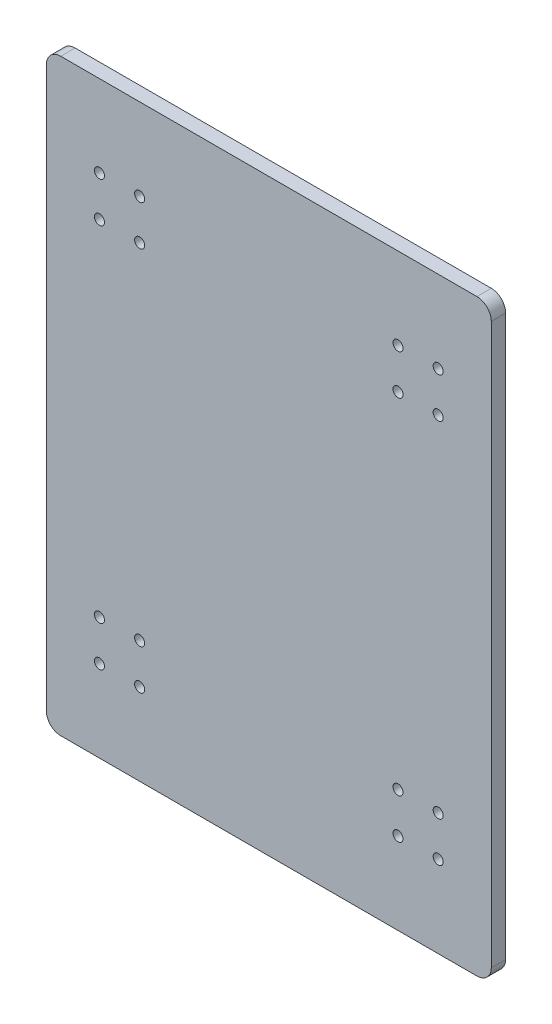
ISO-10303-21;
HEADER;
FILE_DESCRIPTION(('STEP AP214'),'2;1');
FILE_NAME('part.step','',(''),(''),'','','');
FILE_SCHEMA(('AUTOMOTIVE_DESIGN { 1 0 10303 214 1 1 1 1 }'));
ENDSEC;
DATA;
#1=APPLICATION_CONTEXT('core data for automotive mechanical design processes');
#2=APPLICATION_PROTOCOL_DEFINITION('international standard','automotive_design',2000,#1);
#3=PRODUCT_CONTEXT('',#1,'mechanical');
#4=PRODUCT('Part','Part','',(#3));
#5=PRODUCT_RELATED_PRODUCT_CATEGORY('part','',(#4));
#6=PRODUCT_DEFINITION_FORMATION('','',#4);
#7=PRODUCT_DEFINITION_CONTEXT('part definition',#1,'design');
#8=PRODUCT_DEFINITION('design','',#6,#7);
#9=PRODUCT_DEFINITION_SHAPE('','',#8);
#10=(LENGTH_UNIT() NAMED_UNIT(*) SI_UNIT(.MILLI.,.METRE.));
#11=(NAMED_UNIT(*) PLANE_ANGLE_UNIT() SI_UNIT($,.RADIAN.));
#12=(NAMED_UNIT(*) SI_UNIT($,.STERADIAN.) SOLID_ANGLE_UNIT());
#13=UNCERTAINTY_MEASURE_WITH_UNIT(LENGTH_MEASURE(1.E-05),#10,'distance_accuracy_value','');
#14=(GEOMETRIC_REPRESENTATION_CONTEXT(3) GLOBAL_UNCERTAINTY_ASSIGNED_CONTEXT((#13)) GLOBAL_UNIT_ASSIGNED_CONTEXT((#10,
#11,#12)) REPRESENTATION_CONTEXT('',''));
#15=CARTESIAN_POINT('',(0.,0.,0.));
#16=DIRECTION('',(0.,0.,1.));
#17=DIRECTION('',(1.,0.,0.));
#18=AXIS2_PLACEMENT_3D('',#15,#16,#17);
#19=CARTESIAN_POINT('',(77.5,102.5,5.));
#20=DIRECTION('',(-1.,0.,0.));
#21=DIRECTION('',(0.,0.,1.));
#22=AXIS2_PLACEMENT_3D('',#19,#20,#21);
#23=PLANE('',#22);
#24=DIRECTION('',(0.,1.,0.));
#25=VECTOR('',#24,1.);
#26=CARTESIAN_POINT('',(77.5,102.5,5.));
#27=LINE('',#26,#25);
#28=CARTESIAN_POINT('',(77.5,-97.4999999999999,5.));
#29=VERTEX_POINT('',#28);
#30=CARTESIAN_POINT('',(77.5,97.5,5.));
#31=VERTEX_POINT('',#30);
#32=EDGE_CURVE('E141',#29,#31,#27,.T.);
#33=ORIENTED_EDGE('',*,*,#32,.F.);
#34=DIRECTION('',(0.,0.,-1.));
#35=VECTOR('',#34,1.);
#36=CARTESIAN_POINT('',(77.5,-97.4999999999999,5.));
#37=LINE('',#36,#35);
#38=CARTESIAN_POINT('',(77.5,-97.4999999999999,0.));
#39=VERTEX_POINT('',#38);
#40=EDGE_CURVE('E180',#29,#39,#37,.T.);
#41=ORIENTED_EDGE('',*,*,#40,.T.);
#42=DIRECTION('',(0.,1.,0.));
#43=VECTOR('',#42,1.);
#44=CARTESIAN_POINT('',(77.5,102.5,0.));
#45=LINE('',#44,#43);
#46=CARTESIAN_POINT('',(77.5,97.5,0.));
#47=VERTEX_POINT('',#46);
#48=EDGE_CURVE('E195',#39,#47,#45,.T.);
#49=ORIENTED_EDGE('',*,*,#48,.T.);
#50=DIRECTION('',(0.,0.,-1.));
#51=VECTOR('',#50,1.);
#52=CARTESIAN_POINT('',(77.5,97.5,5.));
#53=LINE('',#52,#51);
#54=EDGE_CURVE('E177',#47,#31,#53,.F.);
#55=ORIENTED_EDGE('',*,*,#54,.T.);
#56=EDGE_LOOP('',(#33,#41,#49,#55));
#57=FACE_BOUND('',#56,.T.);
#58=ADVANCED_FACE('F45',(#57),#23,.F.);
#59=CARTESIAN_POINT('',(-77.5,102.5,5.));
#60=DIRECTION('',(0.,-1.,0.));
#61=DIRECTION('',(0.,0.,-1.));
#62=AXIS2_PLACEMENT_3D('',#59,#60,#61);
#63=PLANE('',#62);
#64=DIRECTION('',(-1.,0.,0.));
#65=VECTOR('',#64,1.);
#66=CARTESIAN_POINT('',(-77.5,102.5,5.));
#67=LINE('',#66,#65);
#68=CARTESIAN_POINT('',(72.5,102.5,5.));
#69=VERTEX_POINT('',#68);
#70=CARTESIAN_POINT('',(-72.5,102.5,5.));
#71=VERTEX_POINT('',#70);
#72=EDGE_CURVE('E146',#69,#71,#67,.T.);
#73=ORIENTED_EDGE('',*,*,#72,.F.);
#74=DIRECTION('',(0.,0.,-1.));
#75=VECTOR('',#74,1.);
#76=CARTESIAN_POINT('',(72.5,102.5,5.));
#77=LINE('',#76,#75);
#78=CARTESIAN_POINT('',(72.5,102.5,0.));
#79=VERTEX_POINT('',#78);
#80=EDGE_CURVE('E11',#69,#79,#77,.T.);
#81=ORIENTED_EDGE('',*,*,#80,.T.);
#82=DIRECTION('',(-1.,0.,0.));
#83=VECTOR('',#82,1.);
#84=CARTESIAN_POINT('',(-77.5,102.5,0.));
#85=LINE('',#84,#83);
#86=CARTESIAN_POINT('',(-72.5,102.5,0.));
#87=VERTEX_POINT('',#86);
#88=EDGE_CURVE('E148',#79,#87,#85,.T.);
#89=ORIENTED_EDGE('',*,*,#88,.T.);
#90=DIRECTION('',(0.,0.,-1.));
#91=VECTOR('',#90,1.);
#92=CARTESIAN_POINT('',(-72.5,102.5,5.));
#93=LINE('',#92,#91);
#94=EDGE_CURVE('E54',#87,#71,#93,.F.);
#95=ORIENTED_EDGE('',*,*,#94,.T.);
#96=EDGE_LOOP('',(#73,#81,#89,#95));
#97=FACE_BOUND('',#96,.T.);
#98=ADVANCED_FACE('F201',(#97),#63,.F.);
#99=CARTESIAN_POINT('',(-77.5,102.5,5.));
#100=DIRECTION('',(1.,0.,0.));
#101=DIRECTION('',(0.,1.,0.));
#102=AXIS2_PLACEMENT_3D('',#99,#100,#101);
#103=PLANE('',#102);
#104=DIRECTION('',(0.,-1.,0.));
#105=VECTOR('',#104,1.);
#106=CARTESIAN_POINT('',(-77.5,102.5,0.));
#107=LINE('',#106,#105);
#108=CARTESIAN_POINT('',(-77.5,97.5,0.));
#109=VERTEX_POINT('',#108);
#110=CARTESIAN_POINT('',(-77.5,-97.4999999999999,0.));
#111=VERTEX_POINT('',#110);
#112=EDGE_CURVE('E142',#109,#111,#107,.T.);
#113=ORIENTED_EDGE('',*,*,#112,.T.);
#114=DIRECTION('',(0.,0.,-1.));
#115=VECTOR('',#114,1.);
#116=CARTESIAN_POINT('',(-77.5,-97.4999999999999,5.));
#117=LINE('',#116,#115);
#118=CARTESIAN_POINT('',(-77.5,-97.4999999999999,5.));
#119=VERTEX_POINT('',#118);
#120=EDGE_CURVE('E117',#111,#119,#117,.F.);
#121=ORIENTED_EDGE('',*,*,#120,.T.);
#122=DIRECTION('',(0.,-1.,0.));
#123=VECTOR('',#122,1.);
#124=CARTESIAN_POINT('',(-77.5,102.5,5.));
#125=LINE('',#124,#123);
#126=CARTESIAN_POINT('',(-77.5,97.5,5.));
#127=VERTEX_POINT('',#126);
#128=EDGE_CURVE('E186',#127,#119,#125,.T.);
#129=ORIENTED_EDGE('',*,*,#128,.F.);
#130=DIRECTION('',(0.,0.,-1.));
#131=VECTOR('',#130,1.);
#132=CARTESIAN_POINT('',(-77.5,97.5,5.));
#133=LINE('',#132,#131);
#134=EDGE_CURVE('E123',#127,#109,#133,.T.);
#135=ORIENTED_EDGE('',*,*,#134,.T.);
#136=EDGE_LOOP('',(#113,#121,#129,#135));
#137=FACE_BOUND('',#136,.T.);
#138=ADVANCED_FACE('F208',(#137),#103,.F.);
#139=CARTESIAN_POINT('',(-77.5,-102.5,5.));
#140=DIRECTION('',(0.,1.,0.));
#141=DIRECTION('',(0.,0.,1.));
#142=AXIS2_PLACEMENT_3D('',#139,#140,#141);
#143=PLANE('',#142);
#144=DIRECTION('',(1.,0.,0.));
#145=VECTOR('',#144,1.);
#146=CARTESIAN_POINT('',(-77.5,-102.5,5.));
#147=LINE('',#146,#145);
#148=CARTESIAN_POINT('',(-72.5,-102.5,5.));
#149=VERTEX_POINT('',#148);
#150=CARTESIAN_POINT('',(72.5,-102.5,5.));
#151=VERTEX_POINT('',#150);
#152=EDGE_CURVE('E133',#149,#151,#147,.T.);
#153=ORIENTED_EDGE('',*,*,#152,.F.);
#154=DIRECTION('',(0.,0.,-1.));
#155=VECTOR('',#154,1.);
#156=CARTESIAN_POINT('',(-72.5,-102.5,5.));
#157=LINE('',#156,#155);
#158=CARTESIAN_POINT('',(-72.5,-102.5,0.));
#159=VERTEX_POINT('',#158);
#160=EDGE_CURVE('E116',#149,#159,#157,.T.);
#161=ORIENTED_EDGE('',*,*,#160,.T.);
#162=DIRECTION('',(1.,0.,0.));
#163=VECTOR('',#162,1.);
#164=CARTESIAN_POINT('',(-77.5,-102.5,0.));
#165=LINE('',#164,#163);
#166=CARTESIAN_POINT('',(72.5,-102.5,0.));
#167=VERTEX_POINT('',#166);
#168=EDGE_CURVE('E130',#159,#167,#165,.T.);
#169=ORIENTED_EDGE('',*,*,#168,.T.);
#170=DIRECTION('',(0.,0.,-1.));
#171=VECTOR('',#170,1.);
#172=CARTESIAN_POINT('',(72.5,-102.5,5.));
#173=LINE('',#172,#171);
#174=EDGE_CURVE('E136',#167,#151,#173,.F.);
#175=ORIENTED_EDGE('',*,*,#174,.T.);
#176=EDGE_LOOP('',(#153,#161,#169,#175));
#177=FACE_BOUND('',#176,.T.);
#178=ADVANCED_FACE('F129',(#177),#143,.F.);
#179=CARTESIAN_POINT('',(0.,0.,5.));
#180=DIRECTION('',(0.,0.,1.));
#181=DIRECTION('',(1.,0.,0.));
#182=AXIS2_PLACEMENT_3D('',#179,#180,#181);
#183=PLANE('',#182);
#184=CARTESIAN_POINT('',(-59.,74.,5.));
#185=DIRECTION('',(0.,0.,-1.));
#186=DIRECTION('',(-1.,0.,0.));
#187=AXIS2_PLACEMENT_3D('',#184,#185,#186);
#188=CIRCLE('',#187,1.75);
#189=CARTESIAN_POINT('',(-60.75,74.,5.));
#190=VERTEX_POINT('',#189);
#191=EDGE_CURVE('E627',#190,#190,#188,.T.);
#192=ORIENTED_EDGE('',*,*,#191,.T.);
#193=EDGE_LOOP('',(#192));
#194=FACE_BOUND('',#193,.T.);
#195=CARTESIAN_POINT('',(-45.,60.,5.));
#196=DIRECTION('',(0.,0.,-1.));
#197=DIRECTION('',(-1.,0.,0.));
#198=AXIS2_PLACEMENT_3D('',#195,#196,#197);
#199=CIRCLE('',#198,1.75);
#200=CARTESIAN_POINT('',(-46.75,60.,5.));
#201=VERTEX_POINT('',#200);
#202=EDGE_CURVE('E618',#201,#201,#199,.T.);
#203=ORIENTED_EDGE('',*,*,#202,.T.);
#204=EDGE_LOOP('',(#203));
#205=FACE_BOUND('',#204,.T.);
#206=CARTESIAN_POINT('',(-59.,60.,5.));
#207=DIRECTION('',(0.,0.,-1.));
#208=DIRECTION('',(-1.,0.,0.));
#209=AXIS2_PLACEMENT_3D('',#206,#207,#208);
#210=CIRCLE('',#209,1.75);
#211=CARTESIAN_POINT('',(-60.75,60.,5.));
#212=VERTEX_POINT('',#211);
#213=EDGE_CURVE('E634',#212,#212,#210,.T.);
#214=ORIENTED_EDGE('',*,*,#213,.T.);
#215=EDGE_LOOP('',(#214));
#216=FACE_BOUND('',#215,.T.);
#217=CARTESIAN_POINT('',(-45.,74.,5.));
#218=DIRECTION('',(0.,0.,-1.));
#219=DIRECTION('',(-1.,0.,0.));
#220=AXIS2_PLACEMENT_3D('',#217,#218,#219);
#221=CIRCLE('',#220,1.75);
#222=CARTESIAN_POINT('',(-46.75,74.,5.));
#223=VERTEX_POINT('',#222);
#224=EDGE_CURVE('E610',#223,#223,#221,.T.);
#225=ORIENTED_EDGE('',*,*,#224,.T.);
#226=EDGE_LOOP('',(#225));
#227=FACE_BOUND('',#226,.T.);
#228=CARTESIAN_POINT('',(-59.,-74.,5.));
#229=DIRECTION('',(0.,0.,1.));
#230=DIRECTION('',(-1.,0.,0.));
#231=AXIS2_PLACEMENT_3D('',#228,#229,#230);
#232=CIRCLE('',#231,1.75);
#233=CARTESIAN_POINT('',(-60.75,-74.,5.));
#234=VERTEX_POINT('',#233);
#235=EDGE_CURVE('E595',#234,#234,#232,.T.);
#236=ORIENTED_EDGE('',*,*,#235,.F.);
#237=EDGE_LOOP('',(#236));
#238=FACE_BOUND('',#237,.T.);
#239=CARTESIAN_POINT('',(-45.,-60.,5.));
#240=DIRECTION('',(0.,0.,1.));
#241=DIRECTION('',(-1.,0.,0.));
#242=AXIS2_PLACEMENT_3D('',#239,#240,#241);
#243=CIRCLE('',#242,1.75);
#244=CARTESIAN_POINT('',(-46.75,-60.,5.));
#245=VERTEX_POINT('',#244);
#246=EDGE_CURVE('E586',#245,#245,#243,.T.);
#247=ORIENTED_EDGE('',*,*,#246,.F.);
#248=EDGE_LOOP('',(#247));
#249=FACE_BOUND('',#248,.T.);
#250=CARTESIAN_POINT('',(-59.,-60.,5.));
#251=DIRECTION('',(0.,0.,1.));
#252=DIRECTION('',(-1.,0.,0.));
#253=AXIS2_PLACEMENT_3D('',#250,#251,#252);
#254=CIRCLE('',#253,1.75);
#255=CARTESIAN_POINT('',(-60.75,-60.,5.));
#256=VERTEX_POINT('',#255);
#257=EDGE_CURVE('E602',#256,#256,#254,.T.);
#258=ORIENTED_EDGE('',*,*,#257,.F.);
#259=EDGE_LOOP('',(#258));
#260=FACE_BOUND('',#259,.T.);
#261=CARTESIAN_POINT('',(-45.,-74.,5.));
#262=DIRECTION('',(0.,0.,1.));
#263=DIRECTION('',(-1.,0.,0.));
#264=AXIS2_PLACEMENT_3D('',#261,#262,#263);
#265=CIRCLE('',#264,1.75);
#266=CARTESIAN_POINT('',(-46.75,-74.,5.));
#267=VERTEX_POINT('',#266);
#268=EDGE_CURVE('E578',#267,#267,#265,.T.);
#269=ORIENTED_EDGE('',*,*,#268,.F.);
#270=EDGE_LOOP('',(#269));
#271=FACE_BOUND('',#270,.T.);
#272=CARTESIAN_POINT('',(59.,-74.,5.));
#273=DIRECTION('',(0.,0.,-1.));
#274=DIRECTION('',(1.,0.,0.));
#275=AXIS2_PLACEMENT_3D('',#272,#273,#274);
#276=CIRCLE('',#275,1.75);
#277=CARTESIAN_POINT('',(60.75,-74.,5.));
#278=VERTEX_POINT('',#277);
#279=EDGE_CURVE('E563',#278,#278,#276,.T.);
#280=ORIENTED_EDGE('',*,*,#279,.T.);
#281=EDGE_LOOP('',(#280));
#282=FACE_BOUND('',#281,.T.);
#283=CARTESIAN_POINT('',(45.,-60.,5.));
#284=DIRECTION('',(0.,0.,-1.));
#285=DIRECTION('',(1.,0.,0.));
#286=AXIS2_PLACEMENT_3D('',#283,#284,#285);
#287=CIRCLE('',#286,1.75);
#288=CARTESIAN_POINT('',(46.75,-60.,5.));
#289=VERTEX_POINT('',#288);
#290=EDGE_CURVE('E554',#289,#289,#287,.T.);
#291=ORIENTED_EDGE('',*,*,#290,.T.);
#292=EDGE_LOOP('',(#291));
#293=FACE_BOUND('',#292,.T.);
#294=CARTESIAN_POINT('',(59.,-60.,5.));
#295=DIRECTION('',(0.,0.,-1.));
#296=DIRECTION('',(1.,0.,0.));
#297=AXIS2_PLACEMENT_3D('',#294,#295,#296);
#298=CIRCLE('',#297,1.75);
#299=CARTESIAN_POINT('',(60.75,-60.,5.));
#300=VERTEX_POINT('',#299);
#301=EDGE_CURVE('E570',#300,#300,#298,.T.);
#302=ORIENTED_EDGE('',*,*,#301,.T.);
#303=EDGE_LOOP('',(#302));
#304=FACE_BOUND('',#303,.T.);
#305=CARTESIAN_POINT('',(45.,-74.,5.));
#306=DIRECTION('',(0.,0.,-1.));
#307=DIRECTION('',(1.,0.,0.));
#308=AXIS2_PLACEMENT_3D('',#305,#306,#307);
#309=CIRCLE('',#308,1.75);
#310=CARTESIAN_POINT('',(46.75,-74.,5.));
#311=VERTEX_POINT('',#310);
#312=EDGE_CURVE('E546',#311,#311,#309,.T.);
#313=ORIENTED_EDGE('',*,*,#312,.T.);
#314=EDGE_LOOP('',(#313));
#315=FACE_BOUND('',#314,.T.);
#316=CARTESIAN_POINT('',(59.,74.,5.));
#317=DIRECTION('',(0.,0.,1.));
#318=DIRECTION('',(1.,0.,0.));
#319=AXIS2_PLACEMENT_3D('',#316,#317,#318);
#320=CIRCLE('',#319,1.75);
#321=CARTESIAN_POINT('',(60.75,74.,5.));
#322=VERTEX_POINT('',#321);
#323=EDGE_CURVE('E518',#322,#322,#320,.T.);
#324=ORIENTED_EDGE('',*,*,#323,.F.);
#325=EDGE_LOOP('',(#324));
#326=FACE_BOUND('',#325,.T.);
#327=CARTESIAN_POINT('',(45.,60.,5.));
#328=DIRECTION('',(0.,0.,1.));
#329=DIRECTION('',(1.,0.,0.));
#330=AXIS2_PLACEMENT_3D('',#327,#328,#329);
#331=CIRCLE('',#330,1.75);
#332=CARTESIAN_POINT('',(46.75,60.,5.));
#333=VERTEX_POINT('',#332);
#334=EDGE_CURVE('E530',#333,#333,#331,.T.);
#335=ORIENTED_EDGE('',*,*,#334,.F.);
#336=EDGE_LOOP('',(#335));
#337=FACE_BOUND('',#336,.T.);
#338=CARTESIAN_POINT('',(59.,60.,5.));
#339=DIRECTION('',(0.,0.,1.));
#340=DIRECTION('',(1.,0.,0.));
#341=AXIS2_PLACEMENT_3D('',#338,#339,#340);
#342=CIRCLE('',#341,1.75);
#343=CARTESIAN_POINT('',(60.75,60.,5.));
#344=VERTEX_POINT('',#343);
#345=EDGE_CURVE('E531',#344,#344,#342,.T.);
#346=ORIENTED_EDGE('',*,*,#345,.F.);
#347=EDGE_LOOP('',(#346));
#348=FACE_BOUND('',#347,.T.);
#349=CARTESIAN_POINT('',(45.,74.,5.));
#350=DIRECTION('',(0.,0.,1.));
#351=DIRECTION('',(1.,0.,0.));
#352=AXIS2_PLACEMENT_3D('',#349,#350,#351);
#353=CIRCLE('',#352,1.75);
#354=CARTESIAN_POINT('',(46.75,74.,5.));
#355=VERTEX_POINT('',#354);
#356=EDGE_CURVE('E515',#355,#355,#353,.T.);
#357=ORIENTED_EDGE('',*,*,#356,.F.);
#358=EDGE_LOOP('',(#357));
#359=FACE_BOUND('',#358,.T.);
#360=ORIENTED_EDGE('',*,*,#128,.T.);
#361=CARTESIAN_POINT('',(-72.5,-97.5,5.));
#362=DIRECTION('',(0.,0.,1.));
#363=DIRECTION('',(1.,0.,0.));
#364=AXIS2_PLACEMENT_3D('',#361,#362,#363);
#365=CIRCLE('',#364,5.);
#366=EDGE_CURVE('E174',#119,#149,#365,.T.);
#367=ORIENTED_EDGE('',*,*,#366,.T.);
#368=ORIENTED_EDGE('',*,*,#152,.T.);
#369=CARTESIAN_POINT('',(72.5,-97.4999999999999,5.));
#370=DIRECTION('',(0.,0.,1.));
#371=DIRECTION('',(1.,0.,0.));
#372=AXIS2_PLACEMENT_3D('',#369,#370,#371);
#373=CIRCLE('',#372,5.);
#374=EDGE_CURVE('E171',#151,#29,#373,.T.);
#375=ORIENTED_EDGE('',*,*,#374,.T.);
#376=ORIENTED_EDGE('',*,*,#32,.T.);
#377=CARTESIAN_POINT('',(72.5,97.5,5.));
#378=DIRECTION('',(0.,0.,1.));
#379=DIRECTION('',(1.,0.,0.));
#380=AXIS2_PLACEMENT_3D('',#377,#378,#379);
#381=CIRCLE('',#380,5.);
#382=EDGE_CURVE('E67',#31,#69,#381,.T.);
#383=ORIENTED_EDGE('',*,*,#382,.T.);
#384=ORIENTED_EDGE('',*,*,#72,.T.);
#385=CARTESIAN_POINT('',(-72.5,97.5,5.));
#386=DIRECTION('',(0.,0.,1.));
#387=DIRECTION('',(1.,0.,0.));
#388=AXIS2_PLACEMENT_3D('',#385,#386,#387);
#389=CIRCLE('',#388,5.);
#390=EDGE_CURVE('E166',#71,#127,#389,.T.);
#391=ORIENTED_EDGE('',*,*,#390,.T.);
#392=EDGE_LOOP('',(#360,#367,#368,#375,#376,#383,#384,#391));
#393=FACE_BOUND('',#392,.T.);
#394=ADVANCED_FACE('F206',(#194,#205,#216,#227,#238,#249,#260,#271,#282,#293,#304,#315,#326,
#337,#348,#359,#393),#183,.T.);
#395=CARTESIAN_POINT('',(0.,0.,0.));
#396=DIRECTION('',(0.,0.,1.));
#397=DIRECTION('',(1.,0.,0.));
#398=AXIS2_PLACEMENT_3D('',#395,#396,#397);
#399=PLANE('',#398);
#400=CARTESIAN_POINT('',(-59.,74.,0.));
#401=DIRECTION('',(0.,0.,-1.));
#402=DIRECTION('',(-1.,0.,0.));
#403=AXIS2_PLACEMENT_3D('',#400,#401,#402);
#404=CIRCLE('',#403,1.75);
#405=CARTESIAN_POINT('',(-60.75,74.,0.));
#406=VERTEX_POINT('',#405);
#407=EDGE_CURVE('E614',#406,#406,#404,.T.);
#408=ORIENTED_EDGE('',*,*,#407,.F.);
#409=EDGE_LOOP('',(#408));
#410=FACE_BOUND('',#409,.T.);
#411=CARTESIAN_POINT('',(-45.,60.,0.));
#412=DIRECTION('',(0.,0.,-1.));
#413=DIRECTION('',(-1.,0.,0.));
#414=AXIS2_PLACEMENT_3D('',#411,#412,#413);
#415=CIRCLE('',#414,1.75);
#416=CARTESIAN_POINT('',(-46.75,60.,0.));
#417=VERTEX_POINT('',#416);
#418=EDGE_CURVE('E622',#417,#417,#415,.T.);
#419=ORIENTED_EDGE('',*,*,#418,.F.);
#420=EDGE_LOOP('',(#419));
#421=FACE_BOUND('',#420,.T.);
#422=CARTESIAN_POINT('',(-59.,60.,0.));
#423=DIRECTION('',(0.,0.,-1.));
#424=DIRECTION('',(-1.,0.,0.));
#425=AXIS2_PLACEMENT_3D('',#422,#423,#424);
#426=CIRCLE('',#425,1.75);
#427=CARTESIAN_POINT('',(-60.75,60.,0.));
#428=VERTEX_POINT('',#427);
#429=EDGE_CURVE('E623',#428,#428,#426,.T.);
#430=ORIENTED_EDGE('',*,*,#429,.F.);
#431=EDGE_LOOP('',(#430));
#432=FACE_BOUND('',#431,.T.);
#433=CARTESIAN_POINT('',(-45.,74.,0.));
#434=DIRECTION('',(0.,0.,-1.));
#435=DIRECTION('',(-1.,0.,0.));
#436=AXIS2_PLACEMENT_3D('',#433,#434,#435);
#437=CIRCLE('',#436,1.75);
#438=CARTESIAN_POINT('',(-46.75,74.,0.));
#439=VERTEX_POINT('',#438);
#440=EDGE_CURVE('E606',#439,#439,#437,.T.);
#441=ORIENTED_EDGE('',*,*,#440,.F.);
#442=EDGE_LOOP('',(#441));
#443=FACE_BOUND('',#442,.T.);
#444=CARTESIAN_POINT('',(-59.,-74.,0.));
#445=DIRECTION('',(0.,0.,1.));
#446=DIRECTION('',(-1.,0.,0.));
#447=AXIS2_PLACEMENT_3D('',#444,#445,#446);
#448=CIRCLE('',#447,1.75);
#449=CARTESIAN_POINT('',(-60.75,-74.,0.));
#450=VERTEX_POINT('',#449);
#451=EDGE_CURVE('E582',#450,#450,#448,.T.);
#452=ORIENTED_EDGE('',*,*,#451,.T.);
#453=EDGE_LOOP('',(#452));
#454=FACE_BOUND('',#453,.T.);
#455=CARTESIAN_POINT('',(-45.,-60.,0.));
#456=DIRECTION('',(0.,0.,1.));
#457=DIRECTION('',(-1.,0.,0.));
#458=AXIS2_PLACEMENT_3D('',#455,#456,#457);
#459=CIRCLE('',#458,1.75);
#460=CARTESIAN_POINT('',(-46.75,-60.,0.));
#461=VERTEX_POINT('',#460);
#462=EDGE_CURVE('E590',#461,#461,#459,.T.);
#463=ORIENTED_EDGE('',*,*,#462,.T.);
#464=EDGE_LOOP('',(#463));
#465=FACE_BOUND('',#464,.T.);
#466=CARTESIAN_POINT('',(-59.,-60.,0.));
#467=DIRECTION('',(0.,0.,1.));
#468=DIRECTION('',(-1.,0.,0.));
#469=AXIS2_PLACEMENT_3D('',#466,#467,#468);
#470=CIRCLE('',#469,1.75);
#471=CARTESIAN_POINT('',(-60.75,-60.,0.));
#472=VERTEX_POINT('',#471);
#473=EDGE_CURVE('E591',#472,#472,#470,.T.);
#474=ORIENTED_EDGE('',*,*,#473,.T.);
#475=EDGE_LOOP('',(#474));
#476=FACE_BOUND('',#475,.T.);
#477=CARTESIAN_POINT('',(-45.,-74.,0.));
#478=DIRECTION('',(0.,0.,1.));
#479=DIRECTION('',(-1.,0.,0.));
#480=AXIS2_PLACEMENT_3D('',#477,#478,#479);
#481=CIRCLE('',#480,1.75);
#482=CARTESIAN_POINT('',(-46.75,-74.,0.));
#483=VERTEX_POINT('',#482);
#484=EDGE_CURVE('E574',#483,#483,#481,.T.);
#485=ORIENTED_EDGE('',*,*,#484,.T.);
#486=EDGE_LOOP('',(#485));
#487=FACE_BOUND('',#486,.T.);
#488=CARTESIAN_POINT('',(59.,-74.,0.));
#489=DIRECTION('',(0.,0.,-1.));
#490=DIRECTION('',(1.,0.,0.));
#491=AXIS2_PLACEMENT_3D('',#488,#489,#490);
#492=CIRCLE('',#491,1.75);
#493=CARTESIAN_POINT('',(60.75,-74.,0.));
#494=VERTEX_POINT('',#493);
#495=EDGE_CURVE('E550',#494,#494,#492,.T.);
#496=ORIENTED_EDGE('',*,*,#495,.F.);
#497=EDGE_LOOP('',(#496));
#498=FACE_BOUND('',#497,.T.);
#499=CARTESIAN_POINT('',(45.,-60.,0.));
#500=DIRECTION('',(0.,0.,-1.));
#501=DIRECTION('',(1.,0.,0.));
#502=AXIS2_PLACEMENT_3D('',#499,#500,#501);
#503=CIRCLE('',#502,1.75);
#504=CARTESIAN_POINT('',(46.75,-60.,0.));
#505=VERTEX_POINT('',#504);
#506=EDGE_CURVE('E558',#505,#505,#503,.T.);
#507=ORIENTED_EDGE('',*,*,#506,.F.);
#508=EDGE_LOOP('',(#507));
#509=FACE_BOUND('',#508,.T.);
#510=CARTESIAN_POINT('',(59.,-60.,0.));
#511=DIRECTION('',(0.,0.,-1.));
#512=DIRECTION('',(1.,0.,0.));
#513=AXIS2_PLACEMENT_3D('',#510,#511,#512);
#514=CIRCLE('',#513,1.75);
#515=CARTESIAN_POINT('',(60.75,-60.,0.));
#516=VERTEX_POINT('',#515);
#517=EDGE_CURVE('E559',#516,#516,#514,.T.);
#518=ORIENTED_EDGE('',*,*,#517,.F.);
#519=EDGE_LOOP('',(#518));
#520=FACE_BOUND('',#519,.T.);
#521=CARTESIAN_POINT('',(45.,-74.,0.));
#522=DIRECTION('',(0.,0.,-1.));
#523=DIRECTION('',(1.,0.,0.));
#524=AXIS2_PLACEMENT_3D('',#521,#522,#523);
#525=CIRCLE('',#524,1.75);
#526=CARTESIAN_POINT('',(46.75,-74.,0.));
#527=VERTEX_POINT('',#526);
#528=EDGE_CURVE('E542',#527,#527,#525,.T.);
#529=ORIENTED_EDGE('',*,*,#528,.F.);
#530=EDGE_LOOP('',(#529));
#531=FACE_BOUND('',#530,.T.);
#532=CARTESIAN_POINT('',(59.,74.,0.));
#533=DIRECTION('',(0.,0.,1.));
#534=DIRECTION('',(1.,0.,0.));
#535=AXIS2_PLACEMENT_3D('',#532,#533,#534);
#536=CIRCLE('',#535,1.75);
#537=CARTESIAN_POINT('',(60.75,74.,0.));
#538=VERTEX_POINT('',#537);
#539=EDGE_CURVE('E523',#538,#538,#536,.T.);
#540=ORIENTED_EDGE('',*,*,#539,.T.);
#541=EDGE_LOOP('',(#540));
#542=FACE_BOUND('',#541,.T.);
#543=CARTESIAN_POINT('',(45.,60.,0.));
#544=DIRECTION('',(0.,0.,1.));
#545=DIRECTION('',(1.,0.,0.));
#546=AXIS2_PLACEMENT_3D('',#543,#544,#545);
#547=CIRCLE('',#546,1.75);
#548=CARTESIAN_POINT('',(46.75,60.,0.));
#549=VERTEX_POINT('',#548);
#550=EDGE_CURVE('E526',#549,#549,#547,.T.);
#551=ORIENTED_EDGE('',*,*,#550,.T.);
#552=EDGE_LOOP('',(#551));
#553=FACE_BOUND('',#552,.T.);
#554=CARTESIAN_POINT('',(59.,60.,0.));
#555=DIRECTION('',(0.,0.,1.));
#556=DIRECTION('',(1.,0.,0.));
#557=AXIS2_PLACEMENT_3D('',#554,#555,#556);
#558=CIRCLE('',#557,1.75);
#559=CARTESIAN_POINT('',(60.75,60.,0.));
#560=VERTEX_POINT('',#559);
#561=EDGE_CURVE('E538',#560,#560,#558,.T.);
#562=ORIENTED_EDGE('',*,*,#561,.T.);
#563=EDGE_LOOP('',(#562));
#564=FACE_BOUND('',#563,.T.);
#565=CARTESIAN_POINT('',(45.,74.,0.));
#566=DIRECTION('',(0.,0.,1.));
#567=DIRECTION('',(1.,0.,0.));
#568=AXIS2_PLACEMENT_3D('',#565,#566,#567);
#569=CIRCLE('',#568,1.75);
#570=CARTESIAN_POINT('',(46.75,74.,0.));
#571=VERTEX_POINT('',#570);
#572=EDGE_CURVE('E198',#571,#571,#569,.T.);
#573=ORIENTED_EDGE('',*,*,#572,.T.);
#574=EDGE_LOOP('',(#573));
#575=FACE_BOUND('',#574,.T.);
#576=ORIENTED_EDGE('',*,*,#168,.F.);
#577=CARTESIAN_POINT('',(-72.5,-97.5,0.));
#578=DIRECTION('',(0.,0.,1.));
#579=DIRECTION('',(1.,0.,0.));
#580=AXIS2_PLACEMENT_3D('',#577,#578,#579);
#581=CIRCLE('',#580,5.);
#582=EDGE_CURVE('E112',#159,#111,#581,.F.);
#583=ORIENTED_EDGE('',*,*,#582,.T.);
#584=ORIENTED_EDGE('',*,*,#112,.F.);
#585=CARTESIAN_POINT('',(-72.5,97.5,0.));
#586=DIRECTION('',(0.,0.,1.));
#587=DIRECTION('',(1.,0.,0.));
#588=AXIS2_PLACEMENT_3D('',#585,#586,#587);
#589=CIRCLE('',#588,5.);
#590=EDGE_CURVE('E135',#109,#87,#589,.F.);
#591=ORIENTED_EDGE('',*,*,#590,.T.);
#592=ORIENTED_EDGE('',*,*,#88,.F.);
#593=CARTESIAN_POINT('',(72.5,97.5,0.));
#594=DIRECTION('',(0.,0.,1.));
#595=DIRECTION('',(1.,0.,0.));
#596=AXIS2_PLACEMENT_3D('',#593,#594,#595);
#597=CIRCLE('',#596,5.);
#598=EDGE_CURVE('E156',#79,#47,#597,.F.);
#599=ORIENTED_EDGE('',*,*,#598,.T.);
#600=ORIENTED_EDGE('',*,*,#48,.F.);
#601=CARTESIAN_POINT('',(72.5,-97.4999999999999,0.));
#602=DIRECTION('',(0.,0.,1.));
#603=DIRECTION('',(1.,0.,0.));
#604=AXIS2_PLACEMENT_3D('',#601,#602,#603);
#605=CIRCLE('',#604,5.);
#606=EDGE_CURVE('E124',#39,#167,#605,.F.);
#607=ORIENTED_EDGE('',*,*,#606,.T.);
#608=EDGE_LOOP('',(#576,#583,#584,#591,#592,#599,#600,#607));
#609=FACE_BOUND('',#608,.T.);
#610=ADVANCED_FACE('F138',(#410,#421,#432,#443,#454,#465,#476,#487,#498,#509,#520,#531,#542,
#553,#564,#575,#609),#399,.F.);
#611=CARTESIAN_POINT('',(45.,74.,0.));
#612=DIRECTION('',(0.,0.,1.));
#613=DIRECTION('',(1.,0.,0.));
#614=AXIS2_PLACEMENT_3D('',#611,#612,#613);
#615=CYLINDRICAL_SURFACE('',#614,1.75);
#616=ORIENTED_EDGE('',*,*,#572,.F.);
#617=EDGE_LOOP('',(#616));
#618=FACE_BOUND('',#617,.T.);
#619=ORIENTED_EDGE('',*,*,#356,.T.);
#620=EDGE_LOOP('',(#619));
#621=FACE_BOUND('',#620,.T.);
#622=ADVANCED_FACE('F272',(#618,#621),#615,.F.);
#623=CARTESIAN_POINT('',(59.,60.,0.));
#624=DIRECTION('',(0.,0.,1.));
#625=DIRECTION('',(1.,0.,0.));
#626=AXIS2_PLACEMENT_3D('',#623,#624,#625);
#627=CYLINDRICAL_SURFACE('',#626,1.75);
#628=ORIENTED_EDGE('',*,*,#561,.F.);
#629=EDGE_LOOP('',(#628));
#630=FACE_BOUND('',#629,.T.);
#631=ORIENTED_EDGE('',*,*,#345,.T.);
#632=EDGE_LOOP('',(#631));
#633=FACE_BOUND('',#632,.T.);
#634=ADVANCED_FACE('F460',(#630,#633),#627,.F.);
#635=CARTESIAN_POINT('',(45.,60.,0.));
#636=DIRECTION('',(0.,0.,1.));
#637=DIRECTION('',(1.,0.,0.));
#638=AXIS2_PLACEMENT_3D('',#635,#636,#637);
#639=CYLINDRICAL_SURFACE('',#638,1.75);
#640=ORIENTED_EDGE('',*,*,#550,.F.);
#641=EDGE_LOOP('',(#640));
#642=FACE_BOUND('',#641,.T.);
#643=ORIENTED_EDGE('',*,*,#334,.T.);
#644=EDGE_LOOP('',(#643));
#645=FACE_BOUND('',#644,.T.);
#646=ADVANCED_FACE('F449',(#642,#645),#639,.F.);
#647=CARTESIAN_POINT('',(59.,74.,0.));
#648=DIRECTION('',(0.,0.,1.));
#649=DIRECTION('',(1.,0.,0.));
#650=AXIS2_PLACEMENT_3D('',#647,#648,#649);
#651=CYLINDRICAL_SURFACE('',#650,1.75);
#652=ORIENTED_EDGE('',*,*,#539,.F.);
#653=EDGE_LOOP('',(#652));
#654=FACE_BOUND('',#653,.T.);
#655=ORIENTED_EDGE('',*,*,#323,.T.);
#656=EDGE_LOOP('',(#655));
#657=FACE_BOUND('',#656,.T.);
#658=ADVANCED_FACE('F438',(#654,#657),#651,.F.);
#659=CARTESIAN_POINT('',(45.,-74.,0.));
#660=DIRECTION('',(0.,0.,1.));
#661=DIRECTION('',(1.,0.,0.));
#662=AXIS2_PLACEMENT_3D('',#659,#660,#661);
#663=CYLINDRICAL_SURFACE('',#662,1.75);
#664=ORIENTED_EDGE('',*,*,#528,.T.);
#665=EDGE_LOOP('',(#664));
#666=FACE_BOUND('',#665,.T.);
#667=ORIENTED_EDGE('',*,*,#312,.F.);
#668=EDGE_LOOP('',(#667));
#669=FACE_BOUND('',#668,.T.);
#670=ADVANCED_FACE('F427',(#666,#669),#663,.F.);
#671=CARTESIAN_POINT('',(59.,-60.,0.));
#672=DIRECTION('',(0.,0.,1.));
#673=DIRECTION('',(1.,0.,0.));
#674=AXIS2_PLACEMENT_3D('',#671,#672,#673);
#675=CYLINDRICAL_SURFACE('',#674,1.75);
#676=ORIENTED_EDGE('',*,*,#517,.T.);
#677=EDGE_LOOP('',(#676));
#678=FACE_BOUND('',#677,.T.);
#679=ORIENTED_EDGE('',*,*,#301,.F.);
#680=EDGE_LOOP('',(#679));
#681=FACE_BOUND('',#680,.T.);
#682=ADVANCED_FACE('F416',(#678,#681),#675,.F.);
#683=CARTESIAN_POINT('',(45.,-60.,0.));
#684=DIRECTION('',(0.,0.,1.));
#685=DIRECTION('',(1.,0.,0.));
#686=AXIS2_PLACEMENT_3D('',#683,#684,#685);
#687=CYLINDRICAL_SURFACE('',#686,1.75);
#688=ORIENTED_EDGE('',*,*,#506,.T.);
#689=EDGE_LOOP('',(#688));
#690=FACE_BOUND('',#689,.T.);
#691=ORIENTED_EDGE('',*,*,#290,.F.);
#692=EDGE_LOOP('',(#691));
#693=FACE_BOUND('',#692,.T.);
#694=ADVANCED_FACE('F405',(#690,#693),#687,.F.);
#695=CARTESIAN_POINT('',(59.,-74.,0.));
#696=DIRECTION('',(0.,0.,1.));
#697=DIRECTION('',(1.,0.,0.));
#698=AXIS2_PLACEMENT_3D('',#695,#696,#697);
#699=CYLINDRICAL_SURFACE('',#698,1.75);
#700=ORIENTED_EDGE('',*,*,#495,.T.);
#701=EDGE_LOOP('',(#700));
#702=FACE_BOUND('',#701,.T.);
#703=ORIENTED_EDGE('',*,*,#279,.F.);
#704=EDGE_LOOP('',(#703));
#705=FACE_BOUND('',#704,.T.);
#706=ADVANCED_FACE('F394',(#702,#705),#699,.F.);
#707=CARTESIAN_POINT('',(-45.,-74.,0.));
#708=DIRECTION('',(0.,0.,1.));
#709=DIRECTION('',(1.,0.,0.));
#710=AXIS2_PLACEMENT_3D('',#707,#708,#709);
#711=CYLINDRICAL_SURFACE('',#710,1.75);
#712=ORIENTED_EDGE('',*,*,#484,.F.);
#713=EDGE_LOOP('',(#712));
#714=FACE_BOUND('',#713,.T.);
#715=ORIENTED_EDGE('',*,*,#268,.T.);
#716=EDGE_LOOP('',(#715));
#717=FACE_BOUND('',#716,.T.);
#718=ADVANCED_FACE('F383',(#714,#717),#711,.F.);
#719=CARTESIAN_POINT('',(-59.,-60.,0.));
#720=DIRECTION('',(0.,0.,1.));
#721=DIRECTION('',(1.,0.,0.));
#722=AXIS2_PLACEMENT_3D('',#719,#720,#721);
#723=CYLINDRICAL_SURFACE('',#722,1.75);
#724=ORIENTED_EDGE('',*,*,#473,.F.);
#725=EDGE_LOOP('',(#724));
#726=FACE_BOUND('',#725,.T.);
#727=ORIENTED_EDGE('',*,*,#257,.T.);
#728=EDGE_LOOP('',(#727));
#729=FACE_BOUND('',#728,.T.);
#730=ADVANCED_FACE('F372',(#726,#729),#723,.F.);
#731=CARTESIAN_POINT('',(-45.,-60.,0.));
#732=DIRECTION('',(0.,0.,1.));
#733=DIRECTION('',(1.,0.,0.));
#734=AXIS2_PLACEMENT_3D('',#731,#732,#733);
#735=CYLINDRICAL_SURFACE('',#734,1.75);
#736=ORIENTED_EDGE('',*,*,#462,.F.);
#737=EDGE_LOOP('',(#736));
#738=FACE_BOUND('',#737,.T.);
#739=ORIENTED_EDGE('',*,*,#246,.T.);
#740=EDGE_LOOP('',(#739));
#741=FACE_BOUND('',#740,.T.);
#742=ADVANCED_FACE('F361',(#738,#741),#735,.F.);
#743=CARTESIAN_POINT('',(-59.,-74.,0.));
#744=DIRECTION('',(0.,0.,1.));
#745=DIRECTION('',(1.,0.,0.));
#746=AXIS2_PLACEMENT_3D('',#743,#744,#745);
#747=CYLINDRICAL_SURFACE('',#746,1.75);
#748=ORIENTED_EDGE('',*,*,#451,.F.);
#749=EDGE_LOOP('',(#748));
#750=FACE_BOUND('',#749,.T.);
#751=ORIENTED_EDGE('',*,*,#235,.T.);
#752=EDGE_LOOP('',(#751));
#753=FACE_BOUND('',#752,.T.);
#754=ADVANCED_FACE('F350',(#750,#753),#747,.F.);
#755=CARTESIAN_POINT('',(-45.,74.,0.));
#756=DIRECTION('',(0.,0.,1.));
#757=DIRECTION('',(1.,0.,0.));
#758=AXIS2_PLACEMENT_3D('',#755,#756,#757);
#759=CYLINDRICAL_SURFACE('',#758,1.75);
#760=ORIENTED_EDGE('',*,*,#440,.T.);
#761=EDGE_LOOP('',(#760));
#762=FACE_BOUND('',#761,.T.);
#763=ORIENTED_EDGE('',*,*,#224,.F.);
#764=EDGE_LOOP('',(#763));
#765=FACE_BOUND('',#764,.T.);
#766=ADVANCED_FACE('F339',(#762,#765),#759,.F.);
#767=CARTESIAN_POINT('',(-59.,60.,0.));
#768=DIRECTION('',(0.,0.,1.));
#769=DIRECTION('',(1.,0.,0.));
#770=AXIS2_PLACEMENT_3D('',#767,#768,#769);
#771=CYLINDRICAL_SURFACE('',#770,1.75);
#772=ORIENTED_EDGE('',*,*,#429,.T.);
#773=EDGE_LOOP('',(#772));
#774=FACE_BOUND('',#773,.T.);
#775=ORIENTED_EDGE('',*,*,#213,.F.);
#776=EDGE_LOOP('',(#775));
#777=FACE_BOUND('',#776,.T.);
#778=ADVANCED_FACE('F328',(#774,#777),#771,.F.);
#779=CARTESIAN_POINT('',(-45.,60.,0.));
#780=DIRECTION('',(0.,0.,1.));
#781=DIRECTION('',(1.,0.,0.));
#782=AXIS2_PLACEMENT_3D('',#779,#780,#781);
#783=CYLINDRICAL_SURFACE('',#782,1.75);
#784=ORIENTED_EDGE('',*,*,#418,.T.);
#785=EDGE_LOOP('',(#784));
#786=FACE_BOUND('',#785,.T.);
#787=ORIENTED_EDGE('',*,*,#202,.F.);
#788=EDGE_LOOP('',(#787));
#789=FACE_BOUND('',#788,.T.);
#790=ADVANCED_FACE('F317',(#786,#789),#783,.F.);
#791=CARTESIAN_POINT('',(-59.,74.,0.));
#792=DIRECTION('',(0.,0.,1.));
#793=DIRECTION('',(1.,0.,0.));
#794=AXIS2_PLACEMENT_3D('',#791,#792,#793);
#795=CYLINDRICAL_SURFACE('',#794,1.75);
#796=ORIENTED_EDGE('',*,*,#407,.T.);
#797=EDGE_LOOP('',(#796));
#798=FACE_BOUND('',#797,.T.);
#799=ORIENTED_EDGE('',*,*,#191,.F.);
#800=EDGE_LOOP('',(#799));
#801=FACE_BOUND('',#800,.T.);
#802=ADVANCED_FACE('F227',(#798,#801),#795,.F.);
#803=CARTESIAN_POINT('',(-72.5,-97.5,5.));
#804=DIRECTION('',(0.,0.,-1.));
#805=DIRECTION('',(-1.,0.,0.));
#806=AXIS2_PLACEMENT_3D('',#803,#804,#805);
#807=CYLINDRICAL_SURFACE('',#806,5.);
#808=ORIENTED_EDGE('',*,*,#366,.F.);
#809=ORIENTED_EDGE('',*,*,#120,.F.);
#810=ORIENTED_EDGE('',*,*,#582,.F.);
#811=ORIENTED_EDGE('',*,*,#160,.F.);
#812=EDGE_LOOP('',(#808,#809,#810,#811));
#813=FACE_BOUND('',#812,.T.);
#814=ADVANCED_FACE('F115',(#813),#807,.T.);
#815=CARTESIAN_POINT('',(72.5,-97.4999999999999,5.));
#816=DIRECTION('',(0.,0.,-1.));
#817=DIRECTION('',(-1.,0.,0.));
#818=AXIS2_PLACEMENT_3D('',#815,#816,#817);
#819=CYLINDRICAL_SURFACE('',#818,5.);
#820=ORIENTED_EDGE('',*,*,#374,.F.);
#821=ORIENTED_EDGE('',*,*,#174,.F.);
#822=ORIENTED_EDGE('',*,*,#606,.F.);
#823=ORIENTED_EDGE('',*,*,#40,.F.);
#824=EDGE_LOOP('',(#820,#821,#822,#823));
#825=FACE_BOUND('',#824,.T.);
#826=ADVANCED_FACE('F226',(#825),#819,.T.);
#827=CARTESIAN_POINT('',(72.5,97.5,5.));
#828=DIRECTION('',(0.,0.,-1.));
#829=DIRECTION('',(-1.,0.,0.));
#830=AXIS2_PLACEMENT_3D('',#827,#828,#829);
#831=CYLINDRICAL_SURFACE('',#830,5.);
#832=ORIENTED_EDGE('',*,*,#382,.F.);
#833=ORIENTED_EDGE('',*,*,#54,.F.);
#834=ORIENTED_EDGE('',*,*,#598,.F.);
#835=ORIENTED_EDGE('',*,*,#80,.F.);
#836=EDGE_LOOP('',(#832,#833,#834,#835));
#837=FACE_BOUND('',#836,.T.);
#838=ADVANCED_FACE('F229',(#837),#831,.T.);
#839=CARTESIAN_POINT('',(-72.5,97.5,5.));
#840=DIRECTION('',(0.,0.,-1.));
#841=DIRECTION('',(-1.,0.,0.));
#842=AXIS2_PLACEMENT_3D('',#839,#840,#841);
#843=CYLINDRICAL_SURFACE('',#842,5.);
#844=ORIENTED_EDGE('',*,*,#390,.F.);
#845=ORIENTED_EDGE('',*,*,#94,.F.);
#846=ORIENTED_EDGE('',*,*,#590,.F.);
#847=ORIENTED_EDGE('',*,*,#134,.F.);
#848=EDGE_LOOP('',(#844,#845,#846,#847));
#849=FACE_BOUND('',#848,.T.);
#850=ADVANCED_FACE('F47',(#849),#843,.T.);
#851=CLOSED_SHELL('',(#58,#98,#138,#178,#394,#610,#622,#634,#646,#658,#670,#682,#694,#706,#718,
#730,#742,#754,#766,#778,#790,#802,#814,#826,#838,#850));
#852=MANIFOLD_SOLID_BREP('B2',#851);
#853=ADVANCED_BREP_SHAPE_REPRESENTATION('',(#18,#852),#14);
#854=SHAPE_DEFINITION_REPRESENTATION(#9,#853);
ENDSEC;
END-ISO-10303-21;
